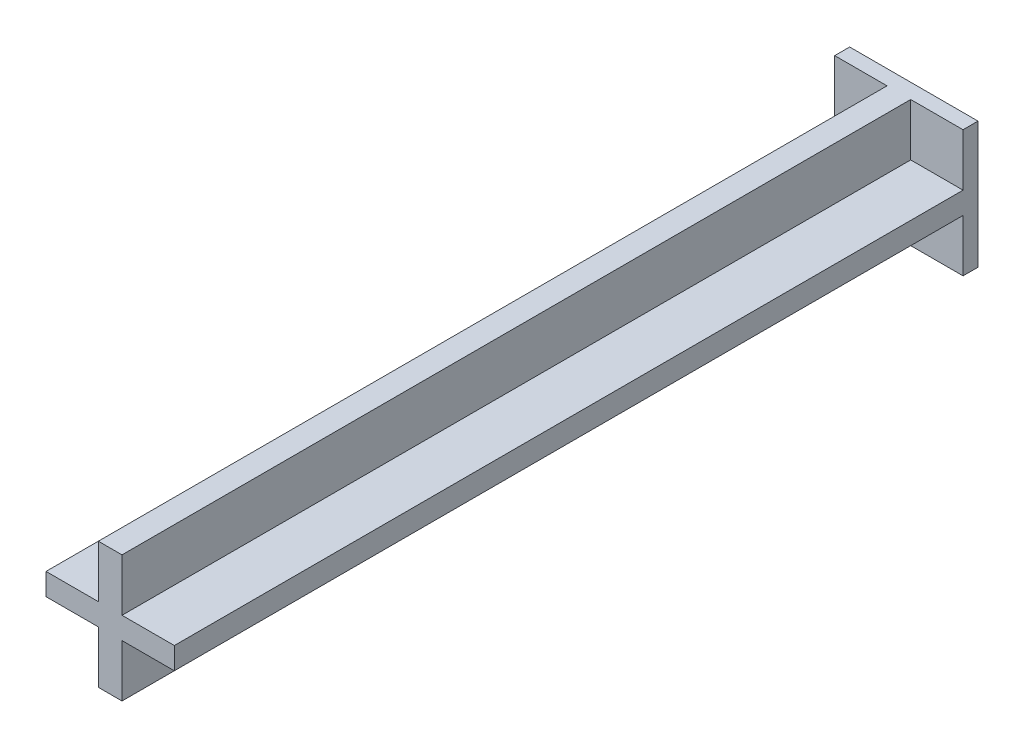
ISO-10303-21;
HEADER;
FILE_DESCRIPTION(('STEP AP214'),'2;1');
FILE_NAME('part.step','',(''),(''),'','','');
FILE_SCHEMA(('AUTOMOTIVE_DESIGN { 1 0 10303 214 1 1 1 1 }'));
ENDSEC;
DATA;
#1=APPLICATION_CONTEXT('core data for automotive mechanical design processes');
#2=APPLICATION_PROTOCOL_DEFINITION('international standard','automotive_design',2000,#1);
#3=PRODUCT_CONTEXT('',#1,'mechanical');
#4=PRODUCT('Part','Part','',(#3));
#5=PRODUCT_RELATED_PRODUCT_CATEGORY('part','',(#4));
#6=PRODUCT_DEFINITION_FORMATION('','',#4);
#7=PRODUCT_DEFINITION_CONTEXT('part definition',#1,'design');
#8=PRODUCT_DEFINITION('design','',#6,#7);
#9=PRODUCT_DEFINITION_SHAPE('','',#8);
#10=(LENGTH_UNIT() NAMED_UNIT(*) SI_UNIT(.MILLI.,.METRE.));
#11=(NAMED_UNIT(*) PLANE_ANGLE_UNIT() SI_UNIT($,.RADIAN.));
#12=(NAMED_UNIT(*) SI_UNIT($,.STERADIAN.) SOLID_ANGLE_UNIT());
#13=UNCERTAINTY_MEASURE_WITH_UNIT(LENGTH_MEASURE(1.E-05),#10,'distance_accuracy_value','');
#14=(GEOMETRIC_REPRESENTATION_CONTEXT(3) GLOBAL_UNCERTAINTY_ASSIGNED_CONTEXT((#13)) GLOBAL_UNIT_ASSIGNED_CONTEXT((#10,
#11,#12)) REPRESENTATION_CONTEXT('',''));
#15=CARTESIAN_POINT('',(0.,0.,0.));
#16=DIRECTION('',(0.,0.,1.));
#17=DIRECTION('',(1.,0.,0.));
#18=AXIS2_PLACEMENT_3D('',#15,#16,#17);
#19=CARTESIAN_POINT('',(-109.,-107.5,1365.));
#20=DIRECTION('',(-1.,0.,0.));
#21=DIRECTION('',(0.,0.,1.));
#22=AXIS2_PLACEMENT_3D('',#19,#20,#21);
#23=PLANE('',#22);
#24=DIRECTION('',(0.,-1.,0.));
#25=VECTOR('',#24,1.);
#26=CARTESIAN_POINT('',(-109.,107.5,25.4));
#27=LINE('',#26,#25);
#28=CARTESIAN_POINT('',(-109.,107.5,25.4));
#29=VERTEX_POINT('',#28);
#30=CARTESIAN_POINT('',(-109.,18.6,25.4));
#31=VERTEX_POINT('',#30);
#32=EDGE_CURVE('E214',#29,#31,#27,.T.);
#33=ORIENTED_EDGE('',*,*,#32,.F.);
#34=DIRECTION('',(0.,0.,-1.));
#35=VECTOR('',#34,1.);
#36=CARTESIAN_POINT('',(-109.,107.5,1365.));
#37=LINE('',#36,#35);
#38=CARTESIAN_POINT('',(-109.,107.5,0.));
#39=VERTEX_POINT('',#38);
#40=EDGE_CURVE('E50',#29,#39,#37,.T.);
#41=ORIENTED_EDGE('',*,*,#40,.T.);
#42=DIRECTION('',(0.,1.,0.));
#43=VECTOR('',#42,1.);
#44=CARTESIAN_POINT('',(-109.,-107.5,0.));
#45=LINE('',#44,#43);
#46=CARTESIAN_POINT('',(-109.,-107.5,0.));
#47=VERTEX_POINT('',#46);
#48=EDGE_CURVE('E283',#47,#39,#45,.T.);
#49=ORIENTED_EDGE('',*,*,#48,.F.);
#50=DIRECTION('',(0.,0.,-1.));
#51=VECTOR('',#50,1.);
#52=CARTESIAN_POINT('',(-109.,-107.5,1365.));
#53=LINE('',#52,#51);
#54=CARTESIAN_POINT('',(-109.,-107.5,25.4));
#55=VERTEX_POINT('',#54);
#56=EDGE_CURVE('E12',#55,#47,#53,.T.);
#57=ORIENTED_EDGE('',*,*,#56,.F.);
#58=DIRECTION('',(0.,-1.,0.));
#59=VECTOR('',#58,1.);
#60=CARTESIAN_POINT('',(-109.,-107.5,25.4));
#61=LINE('',#60,#59);
#62=CARTESIAN_POINT('',(-109.,-18.6,25.4));
#63=VERTEX_POINT('',#62);
#64=EDGE_CURVE('E180',#63,#55,#61,.T.);
#65=ORIENTED_EDGE('',*,*,#64,.F.);
#66=DIRECTION('',(0.,0.,1.));
#67=VECTOR('',#66,1.);
#68=CARTESIAN_POINT('',(-109.,-18.6,-125.723585694968));
#69=LINE('',#68,#67);
#70=CARTESIAN_POINT('',(-109.,-18.6,1365.));
#71=VERTEX_POINT('',#70);
#72=EDGE_CURVE('E197',#63,#71,#69,.T.);
#73=ORIENTED_EDGE('',*,*,#72,.T.);
#74=DIRECTION('',(0.,1.,0.));
#75=VECTOR('',#74,1.);
#76=CARTESIAN_POINT('',(-109.,-107.5,1365.));
#77=LINE('',#76,#75);
#78=CARTESIAN_POINT('',(-109.,18.6,1365.));
#79=VERTEX_POINT('',#78);
#80=EDGE_CURVE('E302',#71,#79,#77,.T.);
#81=ORIENTED_EDGE('',*,*,#80,.T.);
#82=DIRECTION('',(0.,0.,1.));
#83=VECTOR('',#82,1.);
#84=CARTESIAN_POINT('',(-109.,18.6,-125.723585694968));
#85=LINE('',#84,#83);
#86=EDGE_CURVE('E211',#31,#79,#85,.T.);
#87=ORIENTED_EDGE('',*,*,#86,.F.);
#88=EDGE_LOOP('',(#33,#41,#49,#57,#65,#73,#81,#87));
#89=FACE_BOUND('',#88,.T.);
#90=ADVANCED_FACE('F47',(#89),#23,.T.);
#91=CARTESIAN_POINT('',(-109.,-107.5,1365.));
#92=DIRECTION('',(0.,1.,0.));
#93=DIRECTION('',(0.,0.,1.));
#94=AXIS2_PLACEMENT_3D('',#91,#92,#93);
#95=PLANE('',#94);
#96=DIRECTION('',(0.,0.,-1.));
#97=VECTOR('',#96,1.);
#98=CARTESIAN_POINT('',(109.,-107.5,1365.));
#99=LINE('',#98,#97);
#100=CARTESIAN_POINT('',(109.,-107.5,25.4));
#101=VERTEX_POINT('',#100);
#102=CARTESIAN_POINT('',(109.,-107.5,0.));
#103=VERTEX_POINT('',#102);
#104=EDGE_CURVE('E56',#101,#103,#99,.T.);
#105=ORIENTED_EDGE('',*,*,#104,.F.);
#106=DIRECTION('',(1.,0.,0.));
#107=VECTOR('',#106,1.);
#108=CARTESIAN_POINT('',(109.,-107.5,25.4));
#109=LINE('',#108,#107);
#110=CARTESIAN_POINT('',(20.1000000000001,-107.5,25.4));
#111=VERTEX_POINT('',#110);
#112=EDGE_CURVE('E253',#111,#101,#109,.T.);
#113=ORIENTED_EDGE('',*,*,#112,.F.);
#114=DIRECTION('',(0.,0.,1.));
#115=VECTOR('',#114,1.);
#116=CARTESIAN_POINT('',(20.1000000000001,-107.5,-125.723585694968));
#117=LINE('',#116,#115);
#118=CARTESIAN_POINT('',(20.1000000000001,-107.5,1365.));
#119=VERTEX_POINT('',#118);
#120=EDGE_CURVE('E250',#111,#119,#117,.T.);
#121=ORIENTED_EDGE('',*,*,#120,.T.);
#122=DIRECTION('',(1.,0.,0.));
#123=VECTOR('',#122,1.);
#124=CARTESIAN_POINT('',(-109.,-107.5,1365.));
#125=LINE('',#124,#123);
#126=CARTESIAN_POINT('',(-20.1000000000001,-107.5,1365.));
#127=VERTEX_POINT('',#126);
#128=EDGE_CURVE('E190',#127,#119,#125,.T.);
#129=ORIENTED_EDGE('',*,*,#128,.F.);
#130=DIRECTION('',(0.,0.,1.));
#131=VECTOR('',#130,1.);
#132=CARTESIAN_POINT('',(-20.1000000000001,-107.5,-125.723585694968));
#133=LINE('',#132,#131);
#134=CARTESIAN_POINT('',(-20.1000000000001,-107.5,25.4));
#135=VERTEX_POINT('',#134);
#136=EDGE_CURVE('E167',#135,#127,#133,.T.);
#137=ORIENTED_EDGE('',*,*,#136,.F.);
#138=DIRECTION('',(1.,0.,0.));
#139=VECTOR('',#138,1.);
#140=CARTESIAN_POINT('',(-109.,-107.5,25.4));
#141=LINE('',#140,#139);
#142=EDGE_CURVE('E177',#55,#135,#141,.T.);
#143=ORIENTED_EDGE('',*,*,#142,.F.);
#144=ORIENTED_EDGE('',*,*,#56,.T.);
#145=DIRECTION('',(1.,0.,0.));
#146=VECTOR('',#145,1.);
#147=CARTESIAN_POINT('',(-109.,-107.5,0.));
#148=LINE('',#147,#146);
#149=EDGE_CURVE('E307',#47,#103,#148,.T.);
#150=ORIENTED_EDGE('',*,*,#149,.T.);
#151=EDGE_LOOP('',(#105,#113,#121,#129,#137,#143,#144,#150));
#152=FACE_BOUND('',#151,.T.);
#153=ADVANCED_FACE('F187',(#152),#95,.F.);
#154=CARTESIAN_POINT('',(109.,-107.5,1365.));
#155=DIRECTION('',(-1.,0.,0.));
#156=DIRECTION('',(0.,0.,1.));
#157=AXIS2_PLACEMENT_3D('',#154,#155,#156);
#158=PLANE('',#157);
#159=DIRECTION('',(0.,0.,1.));
#160=VECTOR('',#159,1.);
#161=CARTESIAN_POINT('',(109.,-18.6,-125.723585694968));
#162=LINE('',#161,#160);
#163=CARTESIAN_POINT('',(109.,-18.6,25.4));
#164=VERTEX_POINT('',#163);
#165=CARTESIAN_POINT('',(109.,-18.6,1365.));
#166=VERTEX_POINT('',#165);
#167=EDGE_CURVE('E208',#164,#166,#162,.T.);
#168=ORIENTED_EDGE('',*,*,#167,.F.);
#169=DIRECTION('',(0.,1.,0.));
#170=VECTOR('',#169,1.);
#171=CARTESIAN_POINT('',(109.,-107.5,25.4));
#172=LINE('',#171,#170);
#173=EDGE_CURVE('E244',#101,#164,#172,.T.);
#174=ORIENTED_EDGE('',*,*,#173,.F.);
#175=ORIENTED_EDGE('',*,*,#104,.T.);
#176=DIRECTION('',(0.,1.,0.));
#177=VECTOR('',#176,1.);
#178=CARTESIAN_POINT('',(109.,-107.5,0.));
#179=LINE('',#178,#177);
#180=CARTESIAN_POINT('',(109.,107.5,0.));
#181=VERTEX_POINT('',#180);
#182=EDGE_CURVE('E324',#103,#181,#179,.T.);
#183=ORIENTED_EDGE('',*,*,#182,.T.);
#184=DIRECTION('',(0.,0.,-1.));
#185=VECTOR('',#184,1.);
#186=CARTESIAN_POINT('',(109.,107.5,1365.));
#187=LINE('',#186,#185);
#188=CARTESIAN_POINT('',(109.,107.5,25.4));
#189=VERTEX_POINT('',#188);
#190=EDGE_CURVE('E332',#189,#181,#187,.T.);
#191=ORIENTED_EDGE('',*,*,#190,.F.);
#192=DIRECTION('',(0.,1.,0.));
#193=VECTOR('',#192,1.);
#194=CARTESIAN_POINT('',(109.,107.5,25.4));
#195=LINE('',#194,#193);
#196=CARTESIAN_POINT('',(109.,18.6,25.4));
#197=VERTEX_POINT('',#196);
#198=EDGE_CURVE('E280',#197,#189,#195,.T.);
#199=ORIENTED_EDGE('',*,*,#198,.F.);
#200=DIRECTION('',(0.,0.,1.));
#201=VECTOR('',#200,1.);
#202=CARTESIAN_POINT('',(109.,18.6,-125.723585694968));
#203=LINE('',#202,#201);
#204=CARTESIAN_POINT('',(109.,18.6,1365.));
#205=VERTEX_POINT('',#204);
#206=EDGE_CURVE('E284',#197,#205,#203,.T.);
#207=ORIENTED_EDGE('',*,*,#206,.T.);
#208=DIRECTION('',(0.,1.,0.));
#209=VECTOR('',#208,1.);
#210=CARTESIAN_POINT('',(109.,-107.5,1365.));
#211=LINE('',#210,#209);
#212=EDGE_CURVE('E311',#166,#205,#211,.T.);
#213=ORIENTED_EDGE('',*,*,#212,.F.);
#214=EDGE_LOOP('',(#168,#174,#175,#183,#191,#199,#207,#213));
#215=FACE_BOUND('',#214,.T.);
#216=ADVANCED_FACE('F379',(#215),#158,.F.);
#217=CARTESIAN_POINT('',(-109.,107.5,1365.));
#218=DIRECTION('',(0.,1.,0.));
#219=DIRECTION('',(0.,0.,1.));
#220=AXIS2_PLACEMENT_3D('',#217,#218,#219);
#221=PLANE('',#220);
#222=DIRECTION('',(-1.,0.,0.));
#223=VECTOR('',#222,1.);
#224=CARTESIAN_POINT('',(-109.,107.5,25.4));
#225=LINE('',#224,#223);
#226=CARTESIAN_POINT('',(-20.1000000000001,107.5,25.4));
#227=VERTEX_POINT('',#226);
#228=EDGE_CURVE('E224',#227,#29,#225,.T.);
#229=ORIENTED_EDGE('',*,*,#228,.F.);
#230=DIRECTION('',(0.,0.,1.));
#231=VECTOR('',#230,1.);
#232=CARTESIAN_POINT('',(-20.1000000000001,107.5,-125.723585694968));
#233=LINE('',#232,#231);
#234=CARTESIAN_POINT('',(-20.1000000000001,107.5,1365.));
#235=VERTEX_POINT('',#234);
#236=EDGE_CURVE('E220',#227,#235,#233,.T.);
#237=ORIENTED_EDGE('',*,*,#236,.T.);
#238=DIRECTION('',(1.,0.,0.));
#239=VECTOR('',#238,1.);
#240=CARTESIAN_POINT('',(-109.,107.5,1365.));
#241=LINE('',#240,#239);
#242=CARTESIAN_POINT('',(20.1000000000001,107.5,1365.));
#243=VERTEX_POINT('',#242);
#244=EDGE_CURVE('E306',#235,#243,#241,.T.);
#245=ORIENTED_EDGE('',*,*,#244,.T.);
#246=DIRECTION('',(0.,0.,1.));
#247=VECTOR('',#246,1.);
#248=CARTESIAN_POINT('',(20.1000000000001,107.5,-125.723585694968));
#249=LINE('',#248,#247);
#250=CARTESIAN_POINT('',(20.1000000000001,107.5,25.4));
#251=VERTEX_POINT('',#250);
#252=EDGE_CURVE('E279',#251,#243,#249,.T.);
#253=ORIENTED_EDGE('',*,*,#252,.F.);
#254=DIRECTION('',(-1.,0.,0.));
#255=VECTOR('',#254,1.);
#256=CARTESIAN_POINT('',(109.,107.5,25.4));
#257=LINE('',#256,#255);
#258=EDGE_CURVE('E273',#189,#251,#257,.T.);
#259=ORIENTED_EDGE('',*,*,#258,.F.);
#260=ORIENTED_EDGE('',*,*,#190,.T.);
#261=DIRECTION('',(1.,0.,0.));
#262=VECTOR('',#261,1.);
#263=CARTESIAN_POINT('',(-109.,107.5,0.));
#264=LINE('',#263,#262);
#265=EDGE_CURVE('E320',#39,#181,#264,.T.);
#266=ORIENTED_EDGE('',*,*,#265,.F.);
#267=ORIENTED_EDGE('',*,*,#40,.F.);
#268=EDGE_LOOP('',(#229,#237,#245,#253,#259,#260,#266,#267));
#269=FACE_BOUND('',#268,.T.);
#270=ADVANCED_FACE('F345',(#269),#221,.T.);
#271=CARTESIAN_POINT('',(0.,0.,1365.));
#272=DIRECTION('',(0.,0.,-1.));
#273=DIRECTION('',(-1.,0.,0.));
#274=AXIS2_PLACEMENT_3D('',#271,#272,#273);
#275=PLANE('',#274);
#276=DIRECTION('',(0.,1.,0.));
#277=VECTOR('',#276,1.);
#278=CARTESIAN_POINT('',(-20.1000000000001,107.5,1365.));
#279=LINE('',#278,#277);
#280=CARTESIAN_POINT('',(-20.1000000000001,18.6,1365.));
#281=VERTEX_POINT('',#280);
#282=EDGE_CURVE('E236',#281,#235,#279,.T.);
#283=ORIENTED_EDGE('',*,*,#282,.F.);
#284=DIRECTION('',(1.,0.,0.));
#285=VECTOR('',#284,1.);
#286=CARTESIAN_POINT('',(-109.,18.6,1365.));
#287=LINE('',#286,#285);
#288=EDGE_CURVE('E64',#79,#281,#287,.T.);
#289=ORIENTED_EDGE('',*,*,#288,.F.);
#290=ORIENTED_EDGE('',*,*,#80,.F.);
#291=DIRECTION('',(-1.,0.,0.));
#292=VECTOR('',#291,1.);
#293=CARTESIAN_POINT('',(-109.,-18.6,1365.));
#294=LINE('',#293,#292);
#295=CARTESIAN_POINT('',(-20.1000000000001,-18.6,1365.));
#296=VERTEX_POINT('',#295);
#297=EDGE_CURVE('E174',#296,#71,#294,.T.);
#298=ORIENTED_EDGE('',*,*,#297,.F.);
#299=DIRECTION('',(0.,1.,0.));
#300=VECTOR('',#299,1.);
#301=CARTESIAN_POINT('',(-20.1000000000001,-107.5,1365.));
#302=LINE('',#301,#300);
#303=EDGE_CURVE('E205',#127,#296,#302,.T.);
#304=ORIENTED_EDGE('',*,*,#303,.F.);
#305=ORIENTED_EDGE('',*,*,#128,.T.);
#306=DIRECTION('',(0.,-1.,0.));
#307=VECTOR('',#306,1.);
#308=CARTESIAN_POINT('',(20.1000000000001,-107.5,1365.));
#309=LINE('',#308,#307);
#310=CARTESIAN_POINT('',(20.1000000000001,-18.6,1365.));
#311=VERTEX_POINT('',#310);
#312=EDGE_CURVE('E265',#311,#119,#309,.T.);
#313=ORIENTED_EDGE('',*,*,#312,.F.);
#314=DIRECTION('',(-1.,0.,0.));
#315=VECTOR('',#314,1.);
#316=CARTESIAN_POINT('',(109.,-18.6,1365.));
#317=LINE('',#316,#315);
#318=EDGE_CURVE('E72',#166,#311,#317,.T.);
#319=ORIENTED_EDGE('',*,*,#318,.F.);
#320=ORIENTED_EDGE('',*,*,#212,.T.);
#321=DIRECTION('',(1.,0.,0.));
#322=VECTOR('',#321,1.);
#323=CARTESIAN_POINT('',(109.,18.6,1365.));
#324=LINE('',#323,#322);
#325=CARTESIAN_POINT('',(20.1000000000001,18.6,1365.));
#326=VERTEX_POINT('',#325);
#327=EDGE_CURVE('E270',#326,#205,#324,.T.);
#328=ORIENTED_EDGE('',*,*,#327,.F.);
#329=DIRECTION('',(0.,-1.,0.));
#330=VECTOR('',#329,1.);
#331=CARTESIAN_POINT('',(20.1000000000001,107.5,1365.));
#332=LINE('',#331,#330);
#333=EDGE_CURVE('E239',#243,#326,#332,.T.);
#334=ORIENTED_EDGE('',*,*,#333,.F.);
#335=ORIENTED_EDGE('',*,*,#244,.F.);
#336=EDGE_LOOP('',(#283,#289,#290,#298,#304,#305,#313,#319,#320,#328,#334,#335));
#337=FACE_BOUND('',#336,.T.);
#338=ADVANCED_FACE('F356',(#337),#275,.F.);
#339=CARTESIAN_POINT('',(0.,0.,0.));
#340=DIRECTION('',(0.,0.,-1.));
#341=DIRECTION('',(-1.,0.,0.));
#342=AXIS2_PLACEMENT_3D('',#339,#340,#341);
#343=PLANE('',#342);
#344=ORIENTED_EDGE('',*,*,#48,.T.);
#345=ORIENTED_EDGE('',*,*,#265,.T.);
#346=ORIENTED_EDGE('',*,*,#182,.F.);
#347=ORIENTED_EDGE('',*,*,#149,.F.);
#348=EDGE_LOOP('',(#344,#345,#346,#347));
#349=FACE_BOUND('',#348,.T.);
#350=ADVANCED_FACE('F349',(#349),#343,.T.);
#351=CARTESIAN_POINT('',(0.,0.,25.4));
#352=DIRECTION('',(0.,0.,-1.));
#353=DIRECTION('',(-1.,0.,0.));
#354=AXIS2_PLACEMENT_3D('',#351,#352,#353);
#355=PLANE('',#354);
#356=ORIENTED_EDGE('',*,*,#198,.T.);
#357=ORIENTED_EDGE('',*,*,#258,.T.);
#358=DIRECTION('',(0.,-1.,0.));
#359=VECTOR('',#358,1.);
#360=CARTESIAN_POINT('',(20.1000000000001,107.5,25.4));
#361=LINE('',#360,#359);
#362=CARTESIAN_POINT('',(20.1000000000001,18.6,25.4));
#363=VERTEX_POINT('',#362);
#364=EDGE_CURVE('E290',#251,#363,#361,.T.);
#365=ORIENTED_EDGE('',*,*,#364,.T.);
#366=DIRECTION('',(1.,0.,0.));
#367=VECTOR('',#366,1.);
#368=CARTESIAN_POINT('',(109.,18.6,25.4));
#369=LINE('',#368,#367);
#370=EDGE_CURVE('E285',#363,#197,#369,.T.);
#371=ORIENTED_EDGE('',*,*,#370,.T.);
#372=EDGE_LOOP('',(#356,#357,#365,#371));
#373=FACE_BOUND('',#372,.T.);
#374=ADVANCED_FACE('F395',(#373),#355,.F.);
#375=CARTESIAN_POINT('',(20.1000000000001,107.5,-125.723585694968));
#376=DIRECTION('',(-1.,0.,0.));
#377=DIRECTION('',(0.,-1.,0.));
#378=AXIS2_PLACEMENT_3D('',#375,#376,#377);
#379=PLANE('',#378);
#380=ORIENTED_EDGE('',*,*,#252,.T.);
#381=ORIENTED_EDGE('',*,*,#333,.T.);
#382=DIRECTION('',(0.,0.,1.));
#383=VECTOR('',#382,1.);
#384=CARTESIAN_POINT('',(20.1000000000001,18.6,-125.723585694968));
#385=LINE('',#384,#383);
#386=EDGE_CURVE('E289',#363,#326,#385,.T.);
#387=ORIENTED_EDGE('',*,*,#386,.F.);
#388=ORIENTED_EDGE('',*,*,#364,.F.);
#389=EDGE_LOOP('',(#380,#381,#387,#388));
#390=FACE_BOUND('',#389,.T.);
#391=ADVANCED_FACE('F398',(#390),#379,.F.);
#392=CARTESIAN_POINT('',(109.,18.6,-125.723585694968));
#393=DIRECTION('',(0.,-1.,0.));
#394=DIRECTION('',(1.,0.,0.));
#395=AXIS2_PLACEMENT_3D('',#392,#393,#394);
#396=PLANE('',#395);
#397=ORIENTED_EDGE('',*,*,#386,.T.);
#398=ORIENTED_EDGE('',*,*,#327,.T.);
#399=ORIENTED_EDGE('',*,*,#206,.F.);
#400=ORIENTED_EDGE('',*,*,#370,.F.);
#401=EDGE_LOOP('',(#397,#398,#399,#400));
#402=FACE_BOUND('',#401,.T.);
#403=ADVANCED_FACE('F402',(#402),#396,.F.);
#404=CARTESIAN_POINT('',(0.,0.,25.4));
#405=DIRECTION('',(0.,0.,-1.));
#406=DIRECTION('',(-1.,0.,0.));
#407=AXIS2_PLACEMENT_3D('',#404,#405,#406);
#408=PLANE('',#407);
#409=ORIENTED_EDGE('',*,*,#142,.T.);
#410=DIRECTION('',(0.,1.,0.));
#411=VECTOR('',#410,1.);
#412=CARTESIAN_POINT('',(-20.1000000000001,-107.5,25.4));
#413=LINE('',#412,#411);
#414=CARTESIAN_POINT('',(-20.1000000000001,-18.6,25.4));
#415=VERTEX_POINT('',#414);
#416=EDGE_CURVE('E163',#135,#415,#413,.T.);
#417=ORIENTED_EDGE('',*,*,#416,.T.);
#418=DIRECTION('',(-1.,0.,0.));
#419=VECTOR('',#418,1.);
#420=CARTESIAN_POINT('',(-109.,-18.6,25.4));
#421=LINE('',#420,#419);
#422=EDGE_CURVE('E196',#415,#63,#421,.T.);
#423=ORIENTED_EDGE('',*,*,#422,.T.);
#424=ORIENTED_EDGE('',*,*,#64,.T.);
#425=EDGE_LOOP('',(#409,#417,#423,#424));
#426=FACE_BOUND('',#425,.T.);
#427=ADVANCED_FACE('F178',(#426),#408,.F.);
#428=CARTESIAN_POINT('',(-20.1000000000001,-107.5,-125.723585694968));
#429=DIRECTION('',(1.,0.,0.));
#430=DIRECTION('',(0.,1.,0.));
#431=AXIS2_PLACEMENT_3D('',#428,#429,#430);
#432=PLANE('',#431);
#433=ORIENTED_EDGE('',*,*,#136,.T.);
#434=ORIENTED_EDGE('',*,*,#303,.T.);
#435=DIRECTION('',(0.,0.,1.));
#436=VECTOR('',#435,1.);
#437=CARTESIAN_POINT('',(-20.1000000000001,-18.6,-125.723585694968));
#438=LINE('',#437,#436);
#439=EDGE_CURVE('E170',#415,#296,#438,.T.);
#440=ORIENTED_EDGE('',*,*,#439,.F.);
#441=ORIENTED_EDGE('',*,*,#416,.F.);
#442=EDGE_LOOP('',(#433,#434,#440,#441));
#443=FACE_BOUND('',#442,.T.);
#444=ADVANCED_FACE('F165',(#443),#432,.F.);
#445=CARTESIAN_POINT('',(-109.,-18.6,-125.723585694968));
#446=DIRECTION('',(0.,1.,0.));
#447=DIRECTION('',(-1.,0.,0.));
#448=AXIS2_PLACEMENT_3D('',#445,#446,#447);
#449=PLANE('',#448);
#450=ORIENTED_EDGE('',*,*,#439,.T.);
#451=ORIENTED_EDGE('',*,*,#297,.T.);
#452=ORIENTED_EDGE('',*,*,#72,.F.);
#453=ORIENTED_EDGE('',*,*,#422,.F.);
#454=EDGE_LOOP('',(#450,#451,#452,#453));
#455=FACE_BOUND('',#454,.T.);
#456=ADVANCED_FACE('F415',(#455),#449,.F.);
#457=CARTESIAN_POINT('',(0.,0.,25.4));
#458=DIRECTION('',(0.,0.,-1.));
#459=DIRECTION('',(-1.,0.,0.));
#460=AXIS2_PLACEMENT_3D('',#457,#458,#459);
#461=PLANE('',#460);
#462=ORIENTED_EDGE('',*,*,#173,.T.);
#463=DIRECTION('',(-1.,0.,0.));
#464=VECTOR('',#463,1.);
#465=CARTESIAN_POINT('',(109.,-18.6,25.4));
#466=LINE('',#465,#464);
#467=CARTESIAN_POINT('',(20.1000000000001,-18.6,25.4));
#468=VERTEX_POINT('',#467);
#469=EDGE_CURVE('E248',#164,#468,#466,.T.);
#470=ORIENTED_EDGE('',*,*,#469,.T.);
#471=DIRECTION('',(0.,-1.,0.));
#472=VECTOR('',#471,1.);
#473=CARTESIAN_POINT('',(20.1000000000001,-107.5,25.4));
#474=LINE('',#473,#472);
#475=EDGE_CURVE('E249',#468,#111,#474,.T.);
#476=ORIENTED_EDGE('',*,*,#475,.T.);
#477=ORIENTED_EDGE('',*,*,#112,.T.);
#478=EDGE_LOOP('',(#462,#470,#476,#477));
#479=FACE_BOUND('',#478,.T.);
#480=ADVANCED_FACE('F413',(#479),#461,.F.);
#481=CARTESIAN_POINT('',(109.,-18.6,-125.723585694968));
#482=DIRECTION('',(0.,1.,0.));
#483=DIRECTION('',(-1.,0.,0.));
#484=AXIS2_PLACEMENT_3D('',#481,#482,#483);
#485=PLANE('',#484);
#486=ORIENTED_EDGE('',*,*,#167,.T.);
#487=ORIENTED_EDGE('',*,*,#318,.T.);
#488=DIRECTION('',(0.,0.,1.));
#489=VECTOR('',#488,1.);
#490=CARTESIAN_POINT('',(20.1000000000001,-18.6,-125.723585694968));
#491=LINE('',#490,#489);
#492=EDGE_CURVE('E245',#468,#311,#491,.T.);
#493=ORIENTED_EDGE('',*,*,#492,.F.);
#494=ORIENTED_EDGE('',*,*,#469,.F.);
#495=EDGE_LOOP('',(#486,#487,#493,#494));
#496=FACE_BOUND('',#495,.T.);
#497=ADVANCED_FACE('F409',(#496),#485,.F.);
#498=CARTESIAN_POINT('',(20.1000000000001,-107.5,-125.723585694968));
#499=DIRECTION('',(-1.,0.,0.));
#500=DIRECTION('',(0.,-1.,0.));
#501=AXIS2_PLACEMENT_3D('',#498,#499,#500);
#502=PLANE('',#501);
#503=ORIENTED_EDGE('',*,*,#492,.T.);
#504=ORIENTED_EDGE('',*,*,#312,.T.);
#505=ORIENTED_EDGE('',*,*,#120,.F.);
#506=ORIENTED_EDGE('',*,*,#475,.F.);
#507=EDGE_LOOP('',(#503,#504,#505,#506));
#508=FACE_BOUND('',#507,.T.);
#509=ADVANCED_FACE('F372',(#508),#502,.F.);
#510=CARTESIAN_POINT('',(0.,0.,25.4));
#511=DIRECTION('',(0.,0.,-1.));
#512=DIRECTION('',(-1.,0.,0.));
#513=AXIS2_PLACEMENT_3D('',#510,#511,#512);
#514=PLANE('',#513);
#515=ORIENTED_EDGE('',*,*,#32,.T.);
#516=DIRECTION('',(1.,0.,0.));
#517=VECTOR('',#516,1.);
#518=CARTESIAN_POINT('',(-109.,18.6,25.4));
#519=LINE('',#518,#517);
#520=CARTESIAN_POINT('',(-20.1000000000001,18.6,25.4));
#521=VERTEX_POINT('',#520);
#522=EDGE_CURVE('E218',#31,#521,#519,.T.);
#523=ORIENTED_EDGE('',*,*,#522,.T.);
#524=DIRECTION('',(0.,1.,0.));
#525=VECTOR('',#524,1.);
#526=CARTESIAN_POINT('',(-20.1000000000001,107.5,25.4));
#527=LINE('',#526,#525);
#528=EDGE_CURVE('E219',#521,#227,#527,.T.);
#529=ORIENTED_EDGE('',*,*,#528,.T.);
#530=ORIENTED_EDGE('',*,*,#228,.T.);
#531=EDGE_LOOP('',(#515,#523,#529,#530));
#532=FACE_BOUND('',#531,.T.);
#533=ADVANCED_FACE('F363',(#532),#514,.F.);
#534=CARTESIAN_POINT('',(-109.,18.6,-125.723585694968));
#535=DIRECTION('',(0.,-1.,0.));
#536=DIRECTION('',(1.,0.,0.));
#537=AXIS2_PLACEMENT_3D('',#534,#535,#536);
#538=PLANE('',#537);
#539=ORIENTED_EDGE('',*,*,#86,.T.);
#540=ORIENTED_EDGE('',*,*,#288,.T.);
#541=DIRECTION('',(0.,0.,1.));
#542=VECTOR('',#541,1.);
#543=CARTESIAN_POINT('',(-20.1000000000001,18.6,-125.723585694968));
#544=LINE('',#543,#542);
#545=EDGE_CURVE('E215',#521,#281,#544,.T.);
#546=ORIENTED_EDGE('',*,*,#545,.F.);
#547=ORIENTED_EDGE('',*,*,#522,.F.);
#548=EDGE_LOOP('',(#539,#540,#546,#547));
#549=FACE_BOUND('',#548,.T.);
#550=ADVANCED_FACE('F364',(#549),#538,.F.);
#551=CARTESIAN_POINT('',(-20.1000000000001,107.5,-125.723585694968));
#552=DIRECTION('',(1.,0.,0.));
#553=DIRECTION('',(0.,1.,0.));
#554=AXIS2_PLACEMENT_3D('',#551,#552,#553);
#555=PLANE('',#554);
#556=ORIENTED_EDGE('',*,*,#545,.T.);
#557=ORIENTED_EDGE('',*,*,#282,.T.);
#558=ORIENTED_EDGE('',*,*,#236,.F.);
#559=ORIENTED_EDGE('',*,*,#528,.F.);
#560=EDGE_LOOP('',(#556,#557,#558,#559));
#561=FACE_BOUND('',#560,.T.);
#562=ADVANCED_FACE('F360',(#561),#555,.F.);
#563=CLOSED_SHELL('',(#90,#153,#216,#270,#338,#350,#374,#391,#403,#427,#444,#456,#480,#497,#509,
#533,#550,#562));
#564=MANIFOLD_SOLID_BREP('B2',#563);
#565=ADVANCED_BREP_SHAPE_REPRESENTATION('',(#18,#564),#14);
#566=SHAPE_DEFINITION_REPRESENTATION(#9,#565);
ENDSEC;
END-ISO-10303-21;
